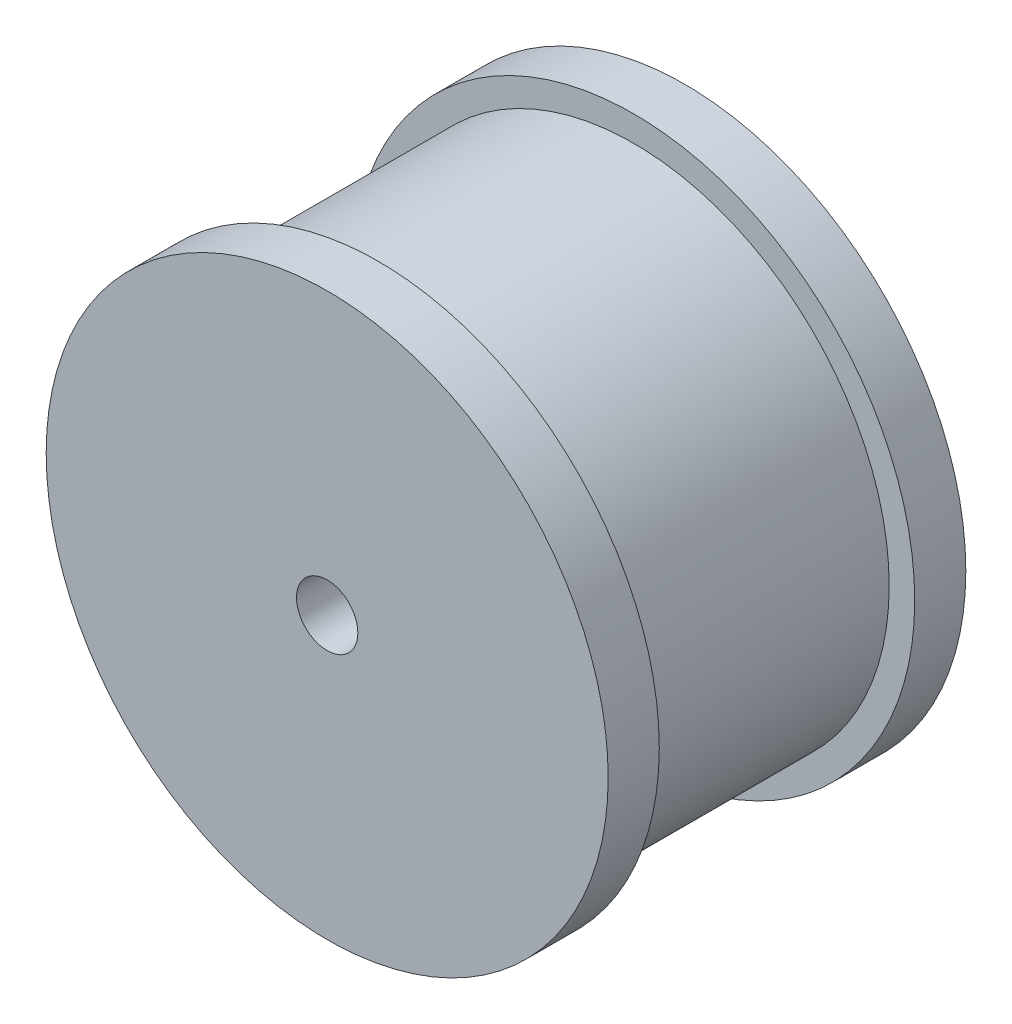
ISO-10303-21;
HEADER;
FILE_DESCRIPTION(('STEP AP214'),'2;1');
FILE_NAME('part.step','',(''),(''),'','','');
FILE_SCHEMA(('AUTOMOTIVE_DESIGN { 1 0 10303 214 1 1 1 1 }'));
ENDSEC;
DATA;
#1=APPLICATION_CONTEXT('core data for automotive mechanical design processes');
#2=APPLICATION_PROTOCOL_DEFINITION('international standard','automotive_design',2000,#1);
#3=PRODUCT_CONTEXT('',#1,'mechanical');
#4=PRODUCT('Part','Part','',(#3));
#5=PRODUCT_RELATED_PRODUCT_CATEGORY('part','',(#4));
#6=PRODUCT_DEFINITION_FORMATION('','',#4);
#7=PRODUCT_DEFINITION_CONTEXT('part definition',#1,'design');
#8=PRODUCT_DEFINITION('design','',#6,#7);
#9=PRODUCT_DEFINITION_SHAPE('','',#8);
#10=(LENGTH_UNIT() NAMED_UNIT(*) SI_UNIT(.MILLI.,.METRE.));
#11=(NAMED_UNIT(*) PLANE_ANGLE_UNIT() SI_UNIT($,.RADIAN.));
#12=(NAMED_UNIT(*) SI_UNIT($,.STERADIAN.) SOLID_ANGLE_UNIT());
#13=UNCERTAINTY_MEASURE_WITH_UNIT(LENGTH_MEASURE(1.E-05),#10,'distance_accuracy_value','');
#14=(GEOMETRIC_REPRESENTATION_CONTEXT(3) GLOBAL_UNCERTAINTY_ASSIGNED_CONTEXT((#13)) GLOBAL_UNIT_ASSIGNED_CONTEXT((#10,
#11,#12)) REPRESENTATION_CONTEXT('',''));
#15=CARTESIAN_POINT('',(0.,0.,0.));
#16=DIRECTION('',(0.,0.,1.));
#17=DIRECTION('',(1.,0.,0.));
#18=AXIS2_PLACEMENT_3D('',#15,#16,#17);
#19=CARTESIAN_POINT('',(0.,0.,25.));
#20=DIRECTION('',(0.,0.,-1.));
#21=DIRECTION('',(-1.,0.,0.));
#22=AXIS2_PLACEMENT_3D('',#19,#20,#21);
#23=CYLINDRICAL_SURFACE('',#22,25.);
#24=CARTESIAN_POINT('',(0.,0.,25.));
#25=DIRECTION('',(0.,0.,1.));
#26=DIRECTION('',(1.,0.,0.));
#27=AXIS2_PLACEMENT_3D('',#24,#25,#26);
#28=CIRCLE('',#27,25.);
#29=CARTESIAN_POINT('',(25.,0.,25.));
#30=VERTEX_POINT('',#29);
#31=EDGE_CURVE('E11',#30,#30,#28,.T.);
#32=ORIENTED_EDGE('',*,*,#31,.F.);
#33=EDGE_LOOP('',(#32));
#34=FACE_BOUND('',#33,.T.);
#35=CARTESIAN_POINT('',(0.,0.,0.));
#36=DIRECTION('',(0.,0.,1.));
#37=DIRECTION('',(1.,0.,0.));
#38=AXIS2_PLACEMENT_3D('',#35,#36,#37);
#39=CIRCLE('',#38,25.);
#40=CARTESIAN_POINT('',(25.,0.,0.));
#41=VERTEX_POINT('',#40);
#42=EDGE_CURVE('E44',#41,#41,#39,.T.);
#43=ORIENTED_EDGE('',*,*,#42,.T.);
#44=EDGE_LOOP('',(#43));
#45=FACE_BOUND('',#44,.T.);
#46=ADVANCED_FACE('F41',(#34,#45),#23,.T.);
#47=CARTESIAN_POINT('',(0.,0.,25.));
#48=DIRECTION('',(0.,0.,-1.));
#49=DIRECTION('',(-1.,0.,0.));
#50=AXIS2_PLACEMENT_3D('',#47,#48,#49);
#51=CYLINDRICAL_SURFACE('',#50,3.);
#52=CARTESIAN_POINT('',(0.,0.,30.));
#53=DIRECTION('',(0.,0.,1.));
#54=DIRECTION('',(1.,0.,0.));
#55=AXIS2_PLACEMENT_3D('',#52,#53,#54);
#56=CIRCLE('',#55,3.);
#57=CARTESIAN_POINT('',(3.,0.,30.));
#58=VERTEX_POINT('',#57);
#59=EDGE_CURVE('E56',#58,#58,#56,.T.);
#60=ORIENTED_EDGE('',*,*,#59,.T.);
#61=EDGE_LOOP('',(#60));
#62=FACE_BOUND('',#61,.T.);
#63=CARTESIAN_POINT('',(0.,0.,-5.));
#64=DIRECTION('',(0.,0.,-1.));
#65=DIRECTION('',(-1.,0.,0.));
#66=AXIS2_PLACEMENT_3D('',#63,#64,#65);
#67=CIRCLE('',#66,3.);
#68=CARTESIAN_POINT('',(-3.,0.,-5.));
#69=VERTEX_POINT('',#68);
#70=EDGE_CURVE('E64',#69,#69,#67,.T.);
#71=ORIENTED_EDGE('',*,*,#70,.T.);
#72=EDGE_LOOP('',(#71));
#73=FACE_BOUND('',#72,.T.);
#74=ADVANCED_FACE('F70',(#62,#73),#51,.F.);
#75=CARTESIAN_POINT('',(0.,0.,30.));
#76=DIRECTION('',(0.,0.,1.));
#77=DIRECTION('',(1.,0.,0.));
#78=AXIS2_PLACEMENT_3D('',#75,#76,#77);
#79=PLANE('',#78);
#80=CARTESIAN_POINT('',(0.,0.,30.));
#81=DIRECTION('',(0.,0.,1.));
#82=DIRECTION('',(1.,0.,0.));
#83=AXIS2_PLACEMENT_3D('',#80,#81,#82);
#84=CIRCLE('',#83,27.5);
#85=CARTESIAN_POINT('',(27.5,0.,30.));
#86=VERTEX_POINT('',#85);
#87=EDGE_CURVE('E48',#86,#86,#84,.T.);
#88=ORIENTED_EDGE('',*,*,#87,.T.);
#89=EDGE_LOOP('',(#88));
#90=FACE_BOUND('',#89,.T.);
#91=ORIENTED_EDGE('',*,*,#59,.F.);
#92=EDGE_LOOP('',(#91));
#93=FACE_BOUND('',#92,.T.);
#94=ADVANCED_FACE('F94',(#90,#93),#79,.T.);
#95=CARTESIAN_POINT('',(0.,0.,25.));
#96=DIRECTION('',(0.,0.,1.));
#97=DIRECTION('',(1.,0.,0.));
#98=AXIS2_PLACEMENT_3D('',#95,#96,#97);
#99=PLANE('',#98);
#100=ORIENTED_EDGE('',*,*,#31,.T.);
#101=EDGE_LOOP('',(#100));
#102=FACE_BOUND('',#101,.T.);
#103=CARTESIAN_POINT('',(0.,0.,25.));
#104=DIRECTION('',(0.,0.,1.));
#105=DIRECTION('',(1.,0.,0.));
#106=AXIS2_PLACEMENT_3D('',#103,#104,#105);
#107=CIRCLE('',#106,27.5);
#108=CARTESIAN_POINT('',(27.5,0.,25.));
#109=VERTEX_POINT('',#108);
#110=EDGE_CURVE('E52',#109,#109,#107,.T.);
#111=ORIENTED_EDGE('',*,*,#110,.F.);
#112=EDGE_LOOP('',(#111));
#113=FACE_BOUND('',#112,.T.);
#114=ADVANCED_FACE('F86',(#102,#113),#99,.F.);
#115=CARTESIAN_POINT('',(0.,0.,30.));
#116=DIRECTION('',(0.,0.,-1.));
#117=DIRECTION('',(-1.,0.,0.));
#118=AXIS2_PLACEMENT_3D('',#115,#116,#117);
#119=CYLINDRICAL_SURFACE('',#118,27.5);
#120=ORIENTED_EDGE('',*,*,#87,.F.);
#121=EDGE_LOOP('',(#120));
#122=FACE_BOUND('',#121,.T.);
#123=ORIENTED_EDGE('',*,*,#110,.T.);
#124=EDGE_LOOP('',(#123));
#125=FACE_BOUND('',#124,.T.);
#126=ADVANCED_FACE('F75',(#122,#125),#119,.T.);
#127=CARTESIAN_POINT('',(0.,0.,-5.));
#128=DIRECTION('',(0.,0.,-1.));
#129=DIRECTION('',(-1.,0.,0.));
#130=AXIS2_PLACEMENT_3D('',#127,#128,#129);
#131=PLANE('',#130);
#132=CARTESIAN_POINT('',(0.,0.,-5.));
#133=DIRECTION('',(0.,0.,-1.));
#134=DIRECTION('',(-1.,0.,0.));
#135=AXIS2_PLACEMENT_3D('',#132,#133,#134);
#136=CIRCLE('',#135,27.5);
#137=CARTESIAN_POINT('',(-27.5,0.,-5.));
#138=VERTEX_POINT('',#137);
#139=EDGE_CURVE('E63',#138,#138,#136,.T.);
#140=ORIENTED_EDGE('',*,*,#139,.T.);
#141=EDGE_LOOP('',(#140));
#142=FACE_BOUND('',#141,.T.);
#143=ORIENTED_EDGE('',*,*,#70,.F.);
#144=EDGE_LOOP('',(#143));
#145=FACE_BOUND('',#144,.T.);
#146=ADVANCED_FACE('F72',(#142,#145),#131,.T.);
#147=CARTESIAN_POINT('',(0.,0.,0.));
#148=DIRECTION('',(0.,0.,-1.));
#149=DIRECTION('',(-1.,0.,0.));
#150=AXIS2_PLACEMENT_3D('',#147,#148,#149);
#151=PLANE('',#150);
#152=ORIENTED_EDGE('',*,*,#42,.F.);
#153=EDGE_LOOP('',(#152));
#154=FACE_BOUND('',#153,.T.);
#155=CARTESIAN_POINT('',(0.,0.,0.));
#156=DIRECTION('',(0.,0.,-1.));
#157=DIRECTION('',(-1.,0.,0.));
#158=AXIS2_PLACEMENT_3D('',#155,#156,#157);
#159=CIRCLE('',#158,27.5);
#160=CARTESIAN_POINT('',(-27.5,0.,0.));
#161=VERTEX_POINT('',#160);
#162=EDGE_CURVE('E60',#161,#161,#159,.T.);
#163=ORIENTED_EDGE('',*,*,#162,.F.);
#164=EDGE_LOOP('',(#163));
#165=FACE_BOUND('',#164,.T.);
#166=ADVANCED_FACE('F74',(#154,#165),#151,.F.);
#167=CARTESIAN_POINT('',(0.,0.,-5.));
#168=DIRECTION('',(0.,0.,1.));
#169=DIRECTION('',(1.,0.,0.));
#170=AXIS2_PLACEMENT_3D('',#167,#168,#169);
#171=CYLINDRICAL_SURFACE('',#170,27.5);
#172=ORIENTED_EDGE('',*,*,#139,.F.);
#173=EDGE_LOOP('',(#172));
#174=FACE_BOUND('',#173,.T.);
#175=ORIENTED_EDGE('',*,*,#162,.T.);
#176=EDGE_LOOP('',(#175));
#177=FACE_BOUND('',#176,.T.);
#178=ADVANCED_FACE('F82',(#174,#177),#171,.T.);
#179=CLOSED_SHELL('',(#46,#74,#94,#114,#126,#146,#166,#178));
#180=MANIFOLD_SOLID_BREP('B2',#179);
#181=ADVANCED_BREP_SHAPE_REPRESENTATION('',(#18,#180),#14);
#182=SHAPE_DEFINITION_REPRESENTATION(#9,#181);
ENDSEC;
END-ISO-10303-21;
